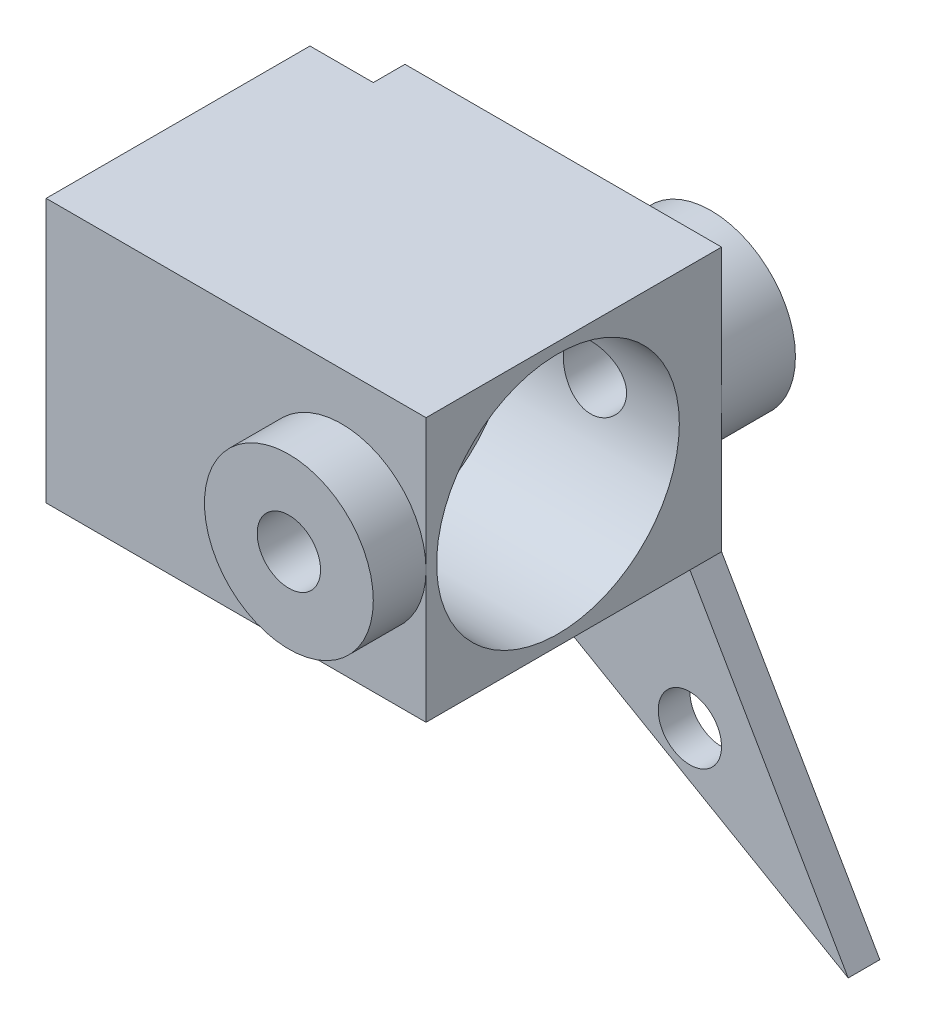
ISO-10303-21;
HEADER;
FILE_DESCRIPTION(('STEP AP214'),'2;1');
FILE_NAME('part.step','',(''),(''),'','','');
FILE_SCHEMA(('AUTOMOTIVE_DESIGN { 1 0 10303 214 1 1 1 1 }'));
ENDSEC;
DATA;
#1=APPLICATION_CONTEXT('core data for automotive mechanical design processes');
#2=APPLICATION_PROTOCOL_DEFINITION('international standard','automotive_design',2000,#1);
#3=PRODUCT_CONTEXT('',#1,'mechanical');
#4=PRODUCT('Part','Part','',(#3));
#5=PRODUCT_RELATED_PRODUCT_CATEGORY('part','',(#4));
#6=PRODUCT_DEFINITION_FORMATION('','',#4);
#7=PRODUCT_DEFINITION_CONTEXT('part definition',#1,'design');
#8=PRODUCT_DEFINITION('design','',#6,#7);
#9=PRODUCT_DEFINITION_SHAPE('','',#8);
#10=(LENGTH_UNIT() NAMED_UNIT(*) SI_UNIT(.MILLI.,.METRE.));
#11=(NAMED_UNIT(*) PLANE_ANGLE_UNIT() SI_UNIT($,.RADIAN.));
#12=(NAMED_UNIT(*) SI_UNIT($,.STERADIAN.) SOLID_ANGLE_UNIT());
#13=UNCERTAINTY_MEASURE_WITH_UNIT(LENGTH_MEASURE(1.E-05),#10,'distance_accuracy_value','');
#14=(GEOMETRIC_REPRESENTATION_CONTEXT(3) GLOBAL_UNCERTAINTY_ASSIGNED_CONTEXT((#13)) GLOBAL_UNIT_ASSIGNED_CONTEXT((#10,
#11,#12)) REPRESENTATION_CONTEXT('',''));
#15=CARTESIAN_POINT('',(0.,0.,0.));
#16=DIRECTION('',(0.,0.,1.));
#17=DIRECTION('',(1.,0.,0.));
#18=AXIS2_PLACEMENT_3D('',#15,#16,#17);
#19=CARTESIAN_POINT('',(0.,0.,0.));
#20=DIRECTION('',(0.,0.,1.));
#21=DIRECTION('',(1.,0.,0.));
#22=AXIS2_PLACEMENT_3D('',#19,#20,#21);
#23=PLANE('',#22);
#24=DIRECTION('',(0.,1.,0.));
#25=VECTOR('',#24,1.);
#26=CARTESIAN_POINT('',(-12.5,0.,0.));
#27=LINE('',#26,#25);
#28=CARTESIAN_POINT('',(-12.5,-12.5,0.));
#29=VERTEX_POINT('',#28);
#30=CARTESIAN_POINT('',(-12.5,12.5,0.));
#31=VERTEX_POINT('',#30);
#32=EDGE_CURVE('E73',#29,#31,#27,.T.);
#33=ORIENTED_EDGE('',*,*,#32,.F.);
#34=DIRECTION('',(1.,0.,0.));
#35=VECTOR('',#34,1.);
#36=CARTESIAN_POINT('',(0.,-12.5,0.));
#37=LINE('',#36,#35);
#38=CARTESIAN_POINT('',(-18.5,-12.5,0.));
#39=VERTEX_POINT('',#38);
#40=EDGE_CURVE('E223',#39,#29,#37,.T.);
#41=ORIENTED_EDGE('',*,*,#40,.F.);
#42=DIRECTION('',(0.,-1.,0.));
#43=VECTOR('',#42,1.);
#44=CARTESIAN_POINT('',(-18.5,-12.5,0.));
#45=LINE('',#44,#43);
#46=CARTESIAN_POINT('',(-18.5,12.5,0.));
#47=VERTEX_POINT('',#46);
#48=EDGE_CURVE('E137',#47,#39,#45,.T.);
#49=ORIENTED_EDGE('',*,*,#48,.F.);
#50=DIRECTION('',(1.,0.,0.));
#51=VECTOR('',#50,1.);
#52=CARTESIAN_POINT('',(0.,12.5,0.));
#53=LINE('',#52,#51);
#54=EDGE_CURVE('E68',#47,#31,#53,.T.);
#55=ORIENTED_EDGE('',*,*,#54,.T.);
#56=EDGE_LOOP('',(#33,#41,#49,#55));
#57=FACE_BOUND('',#56,.T.);
#58=ADVANCED_FACE('F46',(#57),#23,.F.);
#59=CARTESIAN_POINT('',(9.5,0.,-10.));
#60=DIRECTION('',(0.,0.,1.));
#61=DIRECTION('',(1.,0.,0.));
#62=AXIS2_PLACEMENT_3D('',#59,#60,#61);
#63=CYLINDRICAL_SURFACE('',#62,3.);
#64=CARTESIAN_POINT('',(12.5,0.,0.999999999994318));
#65=CARTESIAN_POINT('',(12.4999958061313,0.165513100860299,1.00000261578605));
#66=CARTESIAN_POINT('',(12.4862567268818,0.331071792667569,1.00360852641583));
#67=CARTESIAN_POINT('',(12.4317553681837,0.657428520127667,1.01764330962879));
#68=CARTESIAN_POINT('',(12.3909792667408,0.818224076801244,1.02807567202709));
#69=CARTESIAN_POINT('',(12.2838132581872,1.13029583329107,1.05461056392123));
#70=CARTESIAN_POINT('',(12.2174555774255,1.28158373259807,1.0707059572049));
#71=CARTESIAN_POINT('',(12.0611273860711,1.57088220036603,1.10686126041007));
#72=CARTESIAN_POINT('',(11.9711555735508,1.70889203618857,1.12692138890587));
#73=CARTESIAN_POINT('',(11.7680371060725,1.97079048735204,1.16933565333557));
#74=CARTESIAN_POINT('',(11.6544627072966,2.09434123783155,1.19172766332375));
#75=CARTESIAN_POINT('',(11.40827790935,2.32087548199199,1.23603582075992));
#76=CARTESIAN_POINT('',(11.2756651729633,2.42385644673366,1.25795190940119));
#77=CARTESIAN_POINT('',(10.9924973047783,2.60795448399087,1.29921221666407));
#78=CARTESIAN_POINT('',(10.8416843353429,2.68868668283712,1.31850854350326));
#79=CARTESIAN_POINT('',(10.528041481103,2.82351791781966,1.35178925345616));
#80=CARTESIAN_POINT('',(10.3652137124381,2.87762163115711,1.36577456933189));
#81=CARTESIAN_POINT('',(10.035895846133,2.9564940550528,1.3864593801617));
#82=CARTESIAN_POINT('',(9.86956177362503,2.98187355292015,1.3933103163138));
#83=CARTESIAN_POINT('',(9.53486657150606,3.00448073974606,1.39940344067351));
#84=CARTESIAN_POINT('',(9.36650580845183,3.00171344526939,1.3986469847366));
#85=CARTESIAN_POINT('',(9.03727290222882,2.96859135930547,1.38974654849018));
#86=CARTESIAN_POINT('',(8.87632064812183,2.9389716144502,1.38179941370127));
#87=CARTESIAN_POINT('',(8.56175290049769,2.85416102354825,1.35972772105193));
#88=CARTESIAN_POINT('',(8.40813797183271,2.79896821228888,1.34560268844344));
#89=CARTESIAN_POINT('',(8.1106699876766,2.66396957573277,1.31259096725328));
#90=CARTESIAN_POINT('',(7.96694112372614,2.58390285471208,1.29365421247633));
#91=CARTESIAN_POINT('',(7.69469880263451,2.40161136377509,1.25318013149444));
#92=CARTESIAN_POINT('',(7.56618823075147,2.29938240245393,1.23164231370859));
#93=CARTESIAN_POINT('',(7.32382626318911,2.07189255916669,1.18757014458383));
#94=CARTESIAN_POINT('',(7.2105563268274,1.946013332897,1.16502565182396));
#95=CARTESIAN_POINT('',(7.00661795355001,1.67677263038272,1.12208325375354));
#96=CARTESIAN_POINT('',(6.91595033321012,1.53341052279567,1.101685426013));
#97=CARTESIAN_POINT('',(6.75954950120155,1.23239828878866,1.06521794335912));
#98=CARTESIAN_POINT('',(6.69391768476389,1.0746931981324,1.0491659637199));
#99=CARTESIAN_POINT('',(6.59026320193476,0.749974407216019,1.0233267982061));
#100=CARTESIAN_POINT('',(6.55223477013406,0.582962658651929,1.01353830415281));
#101=CARTESIAN_POINT('',(6.50577064496216,0.249336896290359,1.00152534029361));
#102=CARTESIAN_POINT('',(6.49654396120739,0.0828401568193054,0.999098742576637));
#103=CARTESIAN_POINT('',(6.50576612469069,-0.24932047200086,1.00150378038978));
#104=CARTESIAN_POINT('',(6.52421224328683,-0.414984441848129,1.00633470030155));
#105=CARTESIAN_POINT('',(6.58760640920778,-0.73798019797212,1.0225817643585));
#106=CARTESIAN_POINT('',(6.63211669484639,-0.895403878510947,1.03388906707069));
#107=CARTESIAN_POINT('',(6.74587031770228,-1.20053743045728,1.06180937102979));
#108=CARTESIAN_POINT('',(6.81511627409266,-1.34824627123263,1.0784229341182));
#109=CARTESIAN_POINT('',(6.97786600918619,-1.63285688723239,1.11559030801735));
#110=CARTESIAN_POINT('',(7.07180461133014,-1.7695008228384,1.13621282117842));
#111=CARTESIAN_POINT('',(7.28072321530767,-2.02536444506459,1.17901260171907));
#112=CARTESIAN_POINT('',(7.39570718759906,-2.14458083612579,1.20119016198879));
#113=CARTESIAN_POINT('',(7.64713765571247,-2.36551255989495,1.24533853475134));
#114=CARTESIAN_POINT('',(7.78407826398584,-2.46667088847343,1.26728774019604));
#115=CARTESIAN_POINT('',(8.07345121979507,-2.64457935536873,1.30783498127531));
#116=CARTESIAN_POINT('',(8.22588290134636,-2.72133054240005,1.32643316088029));
#117=CARTESIAN_POINT('',(8.54112583841064,-2.84766857265181,1.3579613427396));
#118=CARTESIAN_POINT('',(8.70386977709193,-2.89741467502046,1.37092448453461));
#119=CARTESIAN_POINT('',(9.03580585053428,-2.96872395986275,1.38973160643499));
#120=CARTESIAN_POINT('',(9.20499641292087,-2.99029396995785,1.39557731121204));
#121=CARTESIAN_POINT('',(9.53933294148051,-3.00425859429513,1.3993480420967));
#122=CARTESIAN_POINT('',(9.70443942703428,-2.99754663404827,1.39751562976714));
#123=CARTESIAN_POINT('',(10.031078743958,-2.95720046555001,1.38670198516372));
#124=CARTESIAN_POINT('',(10.1926116598178,-2.92356689450649,1.37772092209137));
#125=CARTESIAN_POINT('',(10.5064483664403,-2.83083978633454,1.35376309157632));
#126=CARTESIAN_POINT('',(10.658809313993,-2.77192786169538,1.33882914600445));
#127=CARTESIAN_POINT('',(10.9515978984777,-2.63045811008315,1.30464550165221));
#128=CARTESIAN_POINT('',(11.0920237342674,-2.54789672232776,1.28539515306733));
#129=CARTESIAN_POINT('',(11.3612392966653,-2.35873097869853,1.24406835110426));
#130=CARTESIAN_POINT('',(11.4895882249428,-2.25151328856471,1.22192742238949));
#131=CARTESIAN_POINT('',(11.726762822395,-2.01725513432171,1.17768284336483));
#132=CARTESIAN_POINT('',(11.8355837799059,-1.89020990005608,1.1555792033228));
#133=CARTESIAN_POINT('',(12.0327687767881,-1.61680516286449,1.11336600337295));
#134=CARTESIAN_POINT('',(12.1206750591729,-1.47010728053361,1.0933057574504));
#135=CARTESIAN_POINT('',(12.2704391212127,-1.16350012002815,1.05797191112365));
#136=CARTESIAN_POINT('',(12.3323143145445,-1.00359975967301,1.0426951125543));
#137=CARTESIAN_POINT('',(12.4197915871607,-0.703483555588702,1.02072600691194));
#138=CARTESIAN_POINT('',(12.449801628113,-0.564611293459929,1.01300922678294));
#139=CARTESIAN_POINT('',(12.4899067376189,-0.283837014202407,1.00264532961162));
#140=CARTESIAN_POINT('',(12.5000035964397,-0.141935270594578,0.999997756829844));
#141=CARTESIAN_POINT('',(12.5,0.,0.999999999994318));
#142=B_SPLINE_CURVE_WITH_KNOTS('',3,(#64,#65,#66,#67,#68,#69,#70,#71,#72,#73,#74,#75,#76,#77,
#78,#79,#80,#81,#82,#83,#84,#85,#86,#87,#88,#89,#90,#91,#92,#93,#94,#95,#96,#97,#98,#99,#100,
#101,#102,#103,#104,#105,#106,#107,#108,#109,#110,#111,#112,#113,#114,#115,#116,#117,#118,#119,
#120,#121,#122,#123,#124,#125,#126,#127,#128,#129,#130,#131,#132,#133,#134,#135,#136,#137,#138,
#139,#140,#141),.UNSPECIFIED.,.T.,.F.,(4,2,2,2,2,2,2,2,2,2,2,2,2,2,2,2,2,2,2,2,2,2,2,2,2,2,2,2,
2,2,2,2,2,2,2,2,2,2,4),(0.,0.496018922637786,0.992291618127655,1.48794116718857,
1.98361804884229,2.48921443639205,2.99487294596056,3.50879636483811,4.02262948260506,
4.52531823554629,5.02791739652045,5.5171608084105,6.00644182341183,6.50103868312977,
6.99572916456499,7.50583207603594,8.01595341381998,8.52811935034126,9.04017828199353,
9.53804479083304,10.0358622113971,10.5255490579065,11.0152877710096,11.5143071256334,
12.0134207233813,12.52595963138,13.0384765138731,13.5479371169049,14.0572742446952,
14.5506440866168,15.0440022513079,15.533873717558,16.0238189801283,16.5276054380276,
17.0315132854091,17.5456025841075,18.0593474302639,18.4847452383112,18.9101047998123),.UNSPECIFIED.);
#143=CARTESIAN_POINT('',(12.5,0.,0.999999999994318));
#144=VERTEX_POINT('',#143);
#145=EDGE_CURVE('E50',#144,#144,#142,.T.);
#146=ORIENTED_EDGE('',*,*,#145,.T.);
#147=EDGE_LOOP('',(#146));
#148=FACE_BOUND('',#147,.T.);
#149=CARTESIAN_POINT('',(9.5,0.,-10.));
#150=DIRECTION('',(0.,0.,1.));
#151=DIRECTION('',(1.,0.,0.));
#152=AXIS2_PLACEMENT_3D('',#149,#150,#151);
#153=CIRCLE('',#152,3.);
#154=CARTESIAN_POINT('',(12.5,0.,-10.));
#155=VERTEX_POINT('',#154);
#156=EDGE_CURVE('E204',#155,#155,#153,.T.);
#157=ORIENTED_EDGE('',*,*,#156,.F.);
#158=EDGE_LOOP('',(#157));
#159=FACE_BOUND('',#158,.T.);
#160=ADVANCED_FACE('F280',(#148,#159),#63,.F.);
#161=CARTESIAN_POINT('',(17.5,0.,25.));
#162=DIRECTION('',(1.,0.,0.));
#163=DIRECTION('',(0.,0.,-1.));
#164=AXIS2_PLACEMENT_3D('',#161,#162,#163);
#165=PLANE('',#164);
#166=CARTESIAN_POINT('',(17.5,0.,12.4999999999943));
#167=DIRECTION('',(1.,0.,0.));
#168=DIRECTION('',(0.,0.,-1.));
#169=AXIS2_PLACEMENT_3D('',#166,#167,#168);
#170=CIRCLE('',#169,11.5);
#171=CARTESIAN_POINT('',(17.5,0.,0.999999999994316));
#172=VERTEX_POINT('',#171);
#173=EDGE_CURVE('E197',#172,#172,#170,.T.);
#174=ORIENTED_EDGE('',*,*,#173,.F.);
#175=EDGE_LOOP('',(#174));
#176=FACE_BOUND('',#175,.T.);
#177=DIRECTION('',(0.,0.,-1.));
#178=VECTOR('',#177,1.);
#179=CARTESIAN_POINT('',(17.5,-12.5,25.));
#180=LINE('',#179,#178);
#181=CARTESIAN_POINT('',(17.5,-12.5,25.));
#182=VERTEX_POINT('',#181);
#183=CARTESIAN_POINT('',(17.5,-12.5,0.));
#184=VERTEX_POINT('',#183);
#185=EDGE_CURVE('E60',#182,#184,#180,.T.);
#186=ORIENTED_EDGE('',*,*,#185,.T.);
#187=DIRECTION('',(0.,0.,1.));
#188=VECTOR('',#187,1.);
#189=CARTESIAN_POINT('',(17.5,-12.5,-3.));
#190=LINE('',#189,#188);
#191=CARTESIAN_POINT('',(17.5,-12.5,-3.));
#192=VERTEX_POINT('',#191);
#193=EDGE_CURVE('E191',#192,#184,#190,.T.);
#194=ORIENTED_EDGE('',*,*,#193,.F.);
#195=DIRECTION('',(0.,-1.,0.));
#196=VECTOR('',#195,1.);
#197=CARTESIAN_POINT('',(17.5,12.5,-3.));
#198=LINE('',#197,#196);
#199=CARTESIAN_POINT('',(17.5,0.,-3.));
#200=VERTEX_POINT('',#199);
#201=EDGE_CURVE('E153',#200,#192,#198,.T.);
#202=ORIENTED_EDGE('',*,*,#201,.F.);
#203=CARTESIAN_POINT('',(17.5,12.5,-3.));
#204=VERTEX_POINT('',#203);
#205=EDGE_CURVE('E154',#204,#200,#198,.T.);
#206=ORIENTED_EDGE('',*,*,#205,.F.);
#207=DIRECTION('',(0.,0.,-1.));
#208=VECTOR('',#207,1.);
#209=CARTESIAN_POINT('',(17.5,12.5,25.));
#210=LINE('',#209,#208);
#211=CARTESIAN_POINT('',(17.5,12.5,25.));
#212=VERTEX_POINT('',#211);
#213=EDGE_CURVE('E12',#212,#204,#210,.T.);
#214=ORIENTED_EDGE('',*,*,#213,.F.);
#215=DIRECTION('',(0.,-1.,0.));
#216=VECTOR('',#215,1.);
#217=CARTESIAN_POINT('',(17.5,0.,25.));
#218=LINE('',#217,#216);
#219=CARTESIAN_POINT('',(17.5,0.,25.));
#220=VERTEX_POINT('',#219);
#221=EDGE_CURVE('E128',#212,#220,#218,.T.);
#222=ORIENTED_EDGE('',*,*,#221,.T.);
#223=EDGE_CURVE('E219',#220,#182,#218,.T.);
#224=ORIENTED_EDGE('',*,*,#223,.T.);
#225=EDGE_LOOP('',(#186,#194,#202,#206,#214,#222,#224));
#226=FACE_BOUND('',#225,.T.);
#227=ADVANCED_FACE('F48',(#176,#226),#165,.T.);
#228=CARTESIAN_POINT('',(0.,12.5,25.));
#229=DIRECTION('',(0.,1.,0.));
#230=DIRECTION('',(0.,0.,1.));
#231=AXIS2_PLACEMENT_3D('',#228,#229,#230);
#232=PLANE('',#231);
#233=ORIENTED_EDGE('',*,*,#213,.T.);
#234=DIRECTION('',(1.,0.,0.));
#235=VECTOR('',#234,1.);
#236=CARTESIAN_POINT('',(0.,12.5,-3.));
#237=LINE('',#236,#235);
#238=CARTESIAN_POINT('',(-12.5,12.5,-3.));
#239=VERTEX_POINT('',#238);
#240=EDGE_CURVE('E172',#239,#204,#237,.T.);
#241=ORIENTED_EDGE('',*,*,#240,.F.);
#242=DIRECTION('',(0.,0.,1.));
#243=VECTOR('',#242,1.);
#244=CARTESIAN_POINT('',(-12.5,12.5,-3.));
#245=LINE('',#244,#243);
#246=EDGE_CURVE('E175',#239,#31,#245,.T.);
#247=ORIENTED_EDGE('',*,*,#246,.T.);
#248=ORIENTED_EDGE('',*,*,#54,.F.);
#249=DIRECTION('',(0.,0.,-1.));
#250=VECTOR('',#249,1.);
#251=CARTESIAN_POINT('',(-18.5,12.5,25.));
#252=LINE('',#251,#250);
#253=CARTESIAN_POINT('',(-18.5,12.5,25.));
#254=VERTEX_POINT('',#253);
#255=EDGE_CURVE('E133',#254,#47,#252,.T.);
#256=ORIENTED_EDGE('',*,*,#255,.F.);
#257=DIRECTION('',(1.,0.,0.));
#258=VECTOR('',#257,1.);
#259=CARTESIAN_POINT('',(0.,12.5,25.));
#260=LINE('',#259,#258);
#261=EDGE_CURVE('E120',#254,#212,#260,.T.);
#262=ORIENTED_EDGE('',*,*,#261,.T.);
#263=EDGE_LOOP('',(#233,#241,#247,#248,#256,#262));
#264=FACE_BOUND('',#263,.T.);
#265=ADVANCED_FACE('F134',(#264),#232,.T.);
#266=CARTESIAN_POINT('',(0.,-12.5,25.));
#267=DIRECTION('',(0.,1.,0.));
#268=DIRECTION('',(0.,0.,1.));
#269=AXIS2_PLACEMENT_3D('',#266,#267,#268);
#270=PLANE('',#269);
#271=ORIENTED_EDGE('',*,*,#40,.T.);
#272=DIRECTION('',(-1.,0.,0.));
#273=VECTOR('',#272,1.);
#274=CARTESIAN_POINT('',(0.,-12.5,0.));
#275=LINE('',#274,#273);
#276=EDGE_CURVE('E194',#184,#29,#275,.T.);
#277=ORIENTED_EDGE('',*,*,#276,.F.);
#278=ORIENTED_EDGE('',*,*,#185,.F.);
#279=DIRECTION('',(1.,0.,0.));
#280=VECTOR('',#279,1.);
#281=CARTESIAN_POINT('',(0.,-12.5,25.));
#282=LINE('',#281,#280);
#283=CARTESIAN_POINT('',(-18.5,-12.5,25.));
#284=VERTEX_POINT('',#283);
#285=EDGE_CURVE('E130',#284,#182,#282,.T.);
#286=ORIENTED_EDGE('',*,*,#285,.F.);
#287=DIRECTION('',(0.,0.,1.));
#288=VECTOR('',#287,1.);
#289=CARTESIAN_POINT('',(-18.5,-12.5,25.));
#290=LINE('',#289,#288);
#291=EDGE_CURVE('E143',#39,#284,#290,.T.);
#292=ORIENTED_EDGE('',*,*,#291,.F.);
#293=EDGE_LOOP('',(#271,#277,#278,#286,#292));
#294=FACE_BOUND('',#293,.T.);
#295=ADVANCED_FACE('F289',(#294),#270,.F.);
#296=CARTESIAN_POINT('',(0.,0.,25.));
#297=DIRECTION('',(0.,0.,1.));
#298=DIRECTION('',(1.,0.,0.));
#299=AXIS2_PLACEMENT_3D('',#296,#297,#298);
#300=PLANE('',#299);
#301=ORIENTED_EDGE('',*,*,#223,.F.);
#302=CARTESIAN_POINT('',(9.5,0.,25.));
#303=DIRECTION('',(0.,0.,1.));
#304=DIRECTION('',(1.,0.,0.));
#305=AXIS2_PLACEMENT_3D('',#302,#303,#304);
#306=CIRCLE('',#305,8.);
#307=EDGE_CURVE('E213',#220,#220,#306,.T.);
#308=ORIENTED_EDGE('',*,*,#307,.F.);
#309=ORIENTED_EDGE('',*,*,#221,.F.);
#310=ORIENTED_EDGE('',*,*,#261,.F.);
#311=DIRECTION('',(0.,1.,0.));
#312=VECTOR('',#311,1.);
#313=CARTESIAN_POINT('',(-18.5,-12.5,25.));
#314=LINE('',#313,#312);
#315=EDGE_CURVE('E126',#284,#254,#314,.T.);
#316=ORIENTED_EDGE('',*,*,#315,.F.);
#317=ORIENTED_EDGE('',*,*,#285,.T.);
#318=EDGE_LOOP('',(#301,#308,#309,#310,#316,#317));
#319=FACE_BOUND('',#318,.T.);
#320=ADVANCED_FACE('F123',(#319),#300,.T.);
#321=CARTESIAN_POINT('',(9.5,0.,30.));
#322=DIRECTION('',(0.,0.,-1.));
#323=DIRECTION('',(-1.,0.,0.));
#324=AXIS2_PLACEMENT_3D('',#321,#322,#323);
#325=CYLINDRICAL_SURFACE('',#324,8.);
#326=CARTESIAN_POINT('',(9.5,0.,30.));
#327=DIRECTION('',(0.,0.,1.));
#328=DIRECTION('',(1.,0.,0.));
#329=AXIS2_PLACEMENT_3D('',#326,#327,#328);
#330=CIRCLE('',#329,8.);
#331=CARTESIAN_POINT('',(17.5,0.,30.));
#332=VERTEX_POINT('',#331);
#333=EDGE_CURVE('E214',#332,#332,#330,.T.);
#334=ORIENTED_EDGE('',*,*,#333,.F.);
#335=EDGE_LOOP('',(#334));
#336=FACE_BOUND('',#335,.T.);
#337=ORIENTED_EDGE('',*,*,#307,.T.);
#338=EDGE_LOOP('',(#337));
#339=FACE_BOUND('',#338,.T.);
#340=ADVANCED_FACE('F315',(#336,#339),#325,.T.);
#341=CARTESIAN_POINT('',(9.5,0.,30.));
#342=DIRECTION('',(0.,0.,1.));
#343=DIRECTION('',(1.,0.,0.));
#344=AXIS2_PLACEMENT_3D('',#341,#342,#343);
#345=PLANE('',#344);
#346=CARTESIAN_POINT('',(9.5,0.,30.));
#347=DIRECTION('',(0.,0.,1.));
#348=DIRECTION('',(1.,0.,0.));
#349=AXIS2_PLACEMENT_3D('',#346,#347,#348);
#350=CIRCLE('',#349,3.);
#351=CARTESIAN_POINT('',(12.5,0.,30.));
#352=VERTEX_POINT('',#351);
#353=EDGE_CURVE('E208',#352,#352,#350,.T.);
#354=ORIENTED_EDGE('',*,*,#353,.F.);
#355=EDGE_LOOP('',(#354));
#356=FACE_BOUND('',#355,.T.);
#357=ORIENTED_EDGE('',*,*,#333,.T.);
#358=EDGE_LOOP('',(#357));
#359=FACE_BOUND('',#358,.T.);
#360=ADVANCED_FACE('F317',(#356,#359),#345,.T.);
#361=CARTESIAN_POINT('',(9.5,0.,-10.));
#362=DIRECTION('',(0.,0.,1.));
#363=DIRECTION('',(1.,0.,0.));
#364=AXIS2_PLACEMENT_3D('',#361,#362,#363);
#365=CYLINDRICAL_SURFACE('',#364,8.);
#366=CARTESIAN_POINT('',(9.5,0.,-3.));
#367=DIRECTION('',(0.,0.,-1.));
#368=DIRECTION('',(-1.,0.,0.));
#369=AXIS2_PLACEMENT_3D('',#366,#367,#368);
#370=CIRCLE('',#369,8.);
#371=EDGE_CURVE('E161',#200,#200,#370,.F.);
#372=ORIENTED_EDGE('',*,*,#371,.F.);
#373=EDGE_LOOP('',(#372));
#374=FACE_BOUND('',#373,.T.);
#375=CARTESIAN_POINT('',(9.5,0.,-10.));
#376=DIRECTION('',(0.,0.,-1.));
#377=DIRECTION('',(-1.,0.,0.));
#378=AXIS2_PLACEMENT_3D('',#375,#376,#377);
#379=CIRCLE('',#378,8.);
#380=CARTESIAN_POINT('',(1.5,0.,-10.));
#381=VERTEX_POINT('',#380);
#382=EDGE_CURVE('E207',#381,#381,#379,.T.);
#383=ORIENTED_EDGE('',*,*,#382,.F.);
#384=EDGE_LOOP('',(#383));
#385=FACE_BOUND('',#384,.T.);
#386=ADVANCED_FACE('F323',(#374,#385),#365,.T.);
#387=CARTESIAN_POINT('',(9.5,0.,-10.));
#388=DIRECTION('',(0.,0.,-1.));
#389=DIRECTION('',(-1.,0.,0.));
#390=AXIS2_PLACEMENT_3D('',#387,#388,#389);
#391=PLANE('',#390);
#392=ORIENTED_EDGE('',*,*,#156,.T.);
#393=EDGE_LOOP('',(#392));
#394=FACE_BOUND('',#393,.T.);
#395=ORIENTED_EDGE('',*,*,#382,.T.);
#396=EDGE_LOOP('',(#395));
#397=FACE_BOUND('',#396,.T.);
#398=ADVANCED_FACE('F329',(#394,#397),#391,.T.);
#399=CARTESIAN_POINT('',(12.5,0.,23.9999999999943));
#400=CARTESIAN_POINT('',(12.4999958061313,-0.165513100860299,23.9999973842026));
#401=CARTESIAN_POINT('',(12.4862567268818,-0.331071792667569,23.9963914735728));
#402=CARTESIAN_POINT('',(12.4317553681837,-0.657428520127667,23.9823566903598));
#403=CARTESIAN_POINT('',(12.3909792667408,-0.818224076801244,23.9719243279615));
#404=CARTESIAN_POINT('',(12.2838132581872,-1.13029583329107,23.9453894360674));
#405=CARTESIAN_POINT('',(12.2174555774255,-1.28158373259807,23.9292940427837));
#406=CARTESIAN_POINT('',(12.0611273860711,-1.57088220036603,23.8931387395786));
#407=CARTESIAN_POINT('',(11.9711555735508,-1.70889203618857,23.8730786110828));
#408=CARTESIAN_POINT('',(11.7680371060725,-1.97079048735204,23.8306643466531));
#409=CARTESIAN_POINT('',(11.6544627072966,-2.09434123783155,23.8082723366649));
#410=CARTESIAN_POINT('',(11.40827790935,-2.32087548199199,23.7639641792287));
#411=CARTESIAN_POINT('',(11.2756651729633,-2.42385644673366,23.7420480905874));
#412=CARTESIAN_POINT('',(10.9924973047783,-2.60795448399087,23.7007877833246));
#413=CARTESIAN_POINT('',(10.8416843353429,-2.68868668283712,23.6814914564854));
#414=CARTESIAN_POINT('',(10.528041481103,-2.82351791781966,23.6482107465325));
#415=CARTESIAN_POINT('',(10.3652137124381,-2.87762163115711,23.6342254306567));
#416=CARTESIAN_POINT('',(10.035895846133,-2.9564940550528,23.6135406198269));
#417=CARTESIAN_POINT('',(9.86956177362503,-2.98187355292015,23.6066896836748));
#418=CARTESIAN_POINT('',(9.53486657150606,-3.00448073974606,23.6005965593151));
#419=CARTESIAN_POINT('',(9.36650580845183,-3.00171344526939,23.601353015252));
#420=CARTESIAN_POINT('',(9.03727290222881,-2.96859135930547,23.6102534514985));
#421=CARTESIAN_POINT('',(8.87632064812182,-2.9389716144502,23.6182005862874));
#422=CARTESIAN_POINT('',(8.56175290049768,-2.85416102354825,23.6402722789367));
#423=CARTESIAN_POINT('',(8.40813797183271,-2.79896821228888,23.6543973115452));
#424=CARTESIAN_POINT('',(8.1106699876766,-2.66396957573277,23.6874090327354));
#425=CARTESIAN_POINT('',(7.96694112372614,-2.58390285471208,23.7063457875123));
#426=CARTESIAN_POINT('',(7.69469880263451,-2.40161136377509,23.7468198684942));
#427=CARTESIAN_POINT('',(7.56618823075147,-2.29938240245393,23.76835768628));
#428=CARTESIAN_POINT('',(7.32382626318911,-2.07189255916669,23.8124298554048));
#429=CARTESIAN_POINT('',(7.2105563268274,-1.946013332897,23.8349743481647));
#430=CARTESIAN_POINT('',(7.00661795355001,-1.67677263038272,23.8779167462351));
#431=CARTESIAN_POINT('',(6.91595033321012,-1.53341052279567,23.8983145739756));
#432=CARTESIAN_POINT('',(6.75954950120155,-1.23239828878866,23.9347820566295));
#433=CARTESIAN_POINT('',(6.69391768476389,-1.0746931981324,23.9508340362687));
#434=CARTESIAN_POINT('',(6.59026320193476,-0.749974407216019,23.9766732017825));
#435=CARTESIAN_POINT('',(6.55223477013406,-0.582962658651929,23.9864616958358));
#436=CARTESIAN_POINT('',(6.50577064496216,-0.249336896290359,23.998474659695));
#437=CARTESIAN_POINT('',(6.49654396120739,-0.0828401568193055,24.000901257412));
#438=CARTESIAN_POINT('',(6.50576612469069,0.24932047200086,23.9984962195989));
#439=CARTESIAN_POINT('',(6.52421224328683,0.41498444184813,23.9936652996871));
#440=CARTESIAN_POINT('',(6.58760640920778,0.73798019797212,23.9774182356301));
#441=CARTESIAN_POINT('',(6.63211669484639,0.895403878510947,23.9661109329179));
#442=CARTESIAN_POINT('',(6.74587031770228,1.20053743045728,23.9381906289588));
#443=CARTESIAN_POINT('',(6.81511627409266,1.34824627123263,23.9215770658704));
#444=CARTESIAN_POINT('',(6.97786600918619,1.63285688723239,23.8844096919713));
#445=CARTESIAN_POINT('',(7.07180461133014,1.7695008228384,23.8637871788102));
#446=CARTESIAN_POINT('',(7.28072321530767,2.02536444506459,23.8209873982696));
#447=CARTESIAN_POINT('',(7.39570718759906,2.14458083612578,23.7988098379998));
#448=CARTESIAN_POINT('',(7.64713765571247,2.36551255989495,23.7546614652373));
#449=CARTESIAN_POINT('',(7.78407826398584,2.46667088847343,23.7327122597926));
#450=CARTESIAN_POINT('',(8.07345121979507,2.64457935536873,23.6921650187133));
#451=CARTESIAN_POINT('',(8.22588290134636,2.72133054240005,23.6735668391083));
#452=CARTESIAN_POINT('',(8.54112583841064,2.84766857265181,23.642038657249));
#453=CARTESIAN_POINT('',(8.70386977709193,2.89741467502046,23.629075515454));
#454=CARTESIAN_POINT('',(9.03580585053428,2.96872395986275,23.6102683935536));
#455=CARTESIAN_POINT('',(9.20499641292087,2.99029396995785,23.6044226887766));
#456=CARTESIAN_POINT('',(9.53933294148051,3.00425859429513,23.6006519578919));
#457=CARTESIAN_POINT('',(9.70443942703428,2.99754663404827,23.6024843702215));
#458=CARTESIAN_POINT('',(10.031078743958,2.95720046555001,23.6132980148249));
#459=CARTESIAN_POINT('',(10.1926116598178,2.92356689450649,23.6222790778973));
#460=CARTESIAN_POINT('',(10.5064483664403,2.83083978633454,23.6462369084123));
#461=CARTESIAN_POINT('',(10.658809313993,2.77192786169538,23.6611708539842));
#462=CARTESIAN_POINT('',(10.9515978984777,2.63045811008315,23.6953544983364));
#463=CARTESIAN_POINT('',(11.0920237342674,2.54789672232776,23.7146048469213));
#464=CARTESIAN_POINT('',(11.3612392966653,2.35873097869853,23.7559316488844));
#465=CARTESIAN_POINT('',(11.4895882249428,2.25151328856471,23.7780725775991));
#466=CARTESIAN_POINT('',(11.726762822395,2.01725513432172,23.8223171566238));
#467=CARTESIAN_POINT('',(11.8355837799059,1.89020990005608,23.8444207966658));
#468=CARTESIAN_POINT('',(12.0327687767881,1.61680516286449,23.8866339966157));
#469=CARTESIAN_POINT('',(12.1206750591729,1.47010728053361,23.9066942425382));
#470=CARTESIAN_POINT('',(12.2704391212127,1.16350012002815,23.942028088865));
#471=CARTESIAN_POINT('',(12.3323143145445,1.00359975967301,23.9573048874343));
#472=CARTESIAN_POINT('',(12.4197915871607,0.703483555588702,23.9792739930767));
#473=CARTESIAN_POINT('',(12.449801628113,0.564611293459929,23.9869907732057));
#474=CARTESIAN_POINT('',(12.4899067376189,0.283837014202407,23.997354670377));
#475=CARTESIAN_POINT('',(12.5000035964397,0.141935270594578,24.0000022431588));
#476=CARTESIAN_POINT('',(12.5,0.,23.9999999999943));
#477=B_SPLINE_CURVE_WITH_KNOTS('',3,(#399,#400,#401,#402,#403,#404,#405,#406,#407,#408,#409,
#410,#411,#412,#413,#414,#415,#416,#417,#418,#419,#420,#421,#422,#423,#424,#425,#426,#427,#428,
#429,#430,#431,#432,#433,#434,#435,#436,#437,#438,#439,#440,#441,#442,#443,#444,#445,#446,#447,
#448,#449,#450,#451,#452,#453,#454,#455,#456,#457,#458,#459,#460,#461,#462,#463,#464,#465,#466,
#467,#468,#469,#470,#471,#472,#473,#474,#475,#476),.UNSPECIFIED.,.T.,.F.,(4,2,2,2,2,2,2,2,2,2,2,
2,2,2,2,2,2,2,2,2,2,2,2,2,2,2,2,2,2,2,2,2,2,2,2,2,2,2,4),(0.,0.496018922637785,
0.992291618127655,1.48794116718857,1.98361804884229,2.48921443639205,2.99487294596056,
3.50879636483811,4.02262948260506,4.5253182355463,5.02791739652046,5.5171608084105,
6.00644182341183,6.50103868312977,6.99572916456499,7.50583207603594,8.01595341381998,
8.52811935034126,9.04017828199353,9.53804479083304,10.0358622113971,10.5255490579065,
11.0152877710096,11.5143071256334,12.0134207233813,12.52595963138,13.0384765138731,
13.5479371169049,14.0572742446951,14.5506440866168,15.0440022513079,15.533873717558,
16.0238189801283,16.5276054380276,17.0315132854091,17.5456025841075,18.0593474302639,
18.4847452383112,18.9101047998123),.UNSPECIFIED.);
#478=CARTESIAN_POINT('',(12.5,0.,23.9999999999943));
#479=VERTEX_POINT('',#478);
#480=EDGE_CURVE('E201',#479,#479,#477,.T.);
#481=ORIENTED_EDGE('',*,*,#480,.T.);
#482=EDGE_LOOP('',(#481));
#483=FACE_BOUND('',#482,.T.);
#484=ORIENTED_EDGE('',*,*,#353,.T.);
#485=EDGE_LOOP('',(#484));
#486=FACE_BOUND('',#485,.T.);
#487=ADVANCED_FACE('F230',(#483,#486),#63,.F.);
#488=CARTESIAN_POINT('',(1.5,0.,12.4999999999943));
#489=DIRECTION('',(1.,0.,0.));
#490=DIRECTION('',(0.,0.,-1.));
#491=AXIS2_PLACEMENT_3D('',#488,#489,#490);
#492=CYLINDRICAL_SURFACE('',#491,11.5);
#493=ORIENTED_EDGE('',*,*,#480,.F.);
#494=EDGE_LOOP('',(#493));
#495=FACE_BOUND('',#494,.T.);
#496=CARTESIAN_POINT('',(1.5,0.,12.4999999999943));
#497=DIRECTION('',(1.,0.,0.));
#498=DIRECTION('',(0.,0.,-1.));
#499=AXIS2_PLACEMENT_3D('',#496,#497,#498);
#500=CIRCLE('',#499,11.5);
#501=CARTESIAN_POINT('',(1.5,0.,0.999999999994316));
#502=VERTEX_POINT('',#501);
#503=EDGE_CURVE('E198',#502,#502,#500,.T.);
#504=ORIENTED_EDGE('',*,*,#503,.F.);
#505=EDGE_LOOP('',(#504));
#506=FACE_BOUND('',#505,.T.);
#507=ORIENTED_EDGE('',*,*,#173,.T.);
#508=EDGE_LOOP('',(#507));
#509=FACE_BOUND('',#508,.T.);
#510=ORIENTED_EDGE('',*,*,#145,.F.);
#511=EDGE_LOOP('',(#510));
#512=FACE_BOUND('',#511,.T.);
#513=ADVANCED_FACE('F233',(#495,#506,#509,#512),#492,.F.);
#514=CARTESIAN_POINT('',(1.5,0.,12.4999999999943));
#515=DIRECTION('',(1.,0.,0.));
#516=DIRECTION('',(0.,0.,-1.));
#517=AXIS2_PLACEMENT_3D('',#514,#515,#516);
#518=PLANE('',#517);
#519=ORIENTED_EDGE('',*,*,#503,.T.);
#520=EDGE_LOOP('',(#519));
#521=FACE_BOUND('',#520,.T.);
#522=ADVANCED_FACE('F237',(#521),#518,.T.);
#523=CARTESIAN_POINT('',(0.,0.,0.));
#524=DIRECTION('',(0.,0.,-1.));
#525=DIRECTION('',(-1.,0.,0.));
#526=AXIS2_PLACEMENT_3D('',#523,#524,#525);
#527=PLANE('',#526);
#528=CARTESIAN_POINT('',(17.5,-25.4903810567665,0.));
#529=DIRECTION('',(0.,0.,-1.));
#530=DIRECTION('',(-1.,0.,0.));
#531=AXIS2_PLACEMENT_3D('',#528,#529,#530);
#532=CIRCLE('',#531,3.);
#533=CARTESIAN_POINT('',(14.5,-25.4903810567665,0.));
#534=VERTEX_POINT('',#533);
#535=EDGE_CURVE('E157',#534,#534,#532,.T.);
#536=ORIENTED_EDGE('',*,*,#535,.T.);
#537=EDGE_LOOP('',(#536));
#538=FACE_BOUND('',#537,.T.);
#539=DIRECTION('',(0.500000000000004,-0.866025403784436,0.));
#540=VECTOR('',#539,1.);
#541=CARTESIAN_POINT('',(7.71234122634716,4.45272228311383,0.));
#542=LINE('',#541,#540);
#543=CARTESIAN_POINT('',(32.5000000000001,-38.4807621135331,0.));
#544=VERTEX_POINT('',#543);
#545=EDGE_CURVE('E178',#184,#544,#542,.T.);
#546=ORIENTED_EDGE('',*,*,#545,.F.);
#547=ORIENTED_EDGE('',*,*,#276,.T.);
#548=DIRECTION('',(0.86602540378444,-0.499999999999998,0.));
#549=VECTOR('',#548,1.);
#550=CARTESIAN_POINT('',(-8.5376587736527,-14.7876587736528,0.));
#551=LINE('',#550,#549);
#552=EDGE_CURVE('E181',#29,#544,#551,.T.);
#553=ORIENTED_EDGE('',*,*,#552,.T.);
#554=EDGE_LOOP('',(#546,#547,#553));
#555=FACE_BOUND('',#554,.T.);
#556=ADVANCED_FACE('F242',(#538,#555),#527,.F.);
#557=CARTESIAN_POINT('',(7.71234122634716,4.45272228311383,-3.));
#558=DIRECTION('',(-0.866025403784436,-0.500000000000004,0.));
#559=DIRECTION('',(0.500000000000004,-0.866025403784436,0.));
#560=AXIS2_PLACEMENT_3D('',#557,#558,#559);
#561=PLANE('',#560);
#562=ORIENTED_EDGE('',*,*,#545,.T.);
#563=DIRECTION('',(0.,0.,1.));
#564=VECTOR('',#563,1.);
#565=CARTESIAN_POINT('',(32.5000000000001,-38.4807621135331,-3.));
#566=LINE('',#565,#564);
#567=CARTESIAN_POINT('',(32.5000000000001,-38.4807621135331,-3.));
#568=VERTEX_POINT('',#567);
#569=EDGE_CURVE('E189',#568,#544,#566,.T.);
#570=ORIENTED_EDGE('',*,*,#569,.F.);
#571=DIRECTION('',(0.500000000000004,-0.866025403784436,0.));
#572=VECTOR('',#571,1.);
#573=CARTESIAN_POINT('',(7.71234122634716,4.45272228311383,-3.));
#574=LINE('',#573,#572);
#575=EDGE_CURVE('E164',#192,#568,#574,.T.);
#576=ORIENTED_EDGE('',*,*,#575,.F.);
#577=ORIENTED_EDGE('',*,*,#193,.T.);
#578=EDGE_LOOP('',(#562,#570,#576,#577));
#579=FACE_BOUND('',#578,.T.);
#580=ADVANCED_FACE('F250',(#579),#561,.F.);
#581=CARTESIAN_POINT('',(-8.5376587736527,-14.7876587736528,-3.));
#582=DIRECTION('',(-0.499999999999998,-0.86602540378444,0.));
#583=DIRECTION('',(0.86602540378444,-0.499999999999998,0.));
#584=AXIS2_PLACEMENT_3D('',#581,#582,#583);
#585=PLANE('',#584);
#586=ORIENTED_EDGE('',*,*,#552,.F.);
#587=DIRECTION('',(0.,0.,1.));
#588=VECTOR('',#587,1.);
#589=CARTESIAN_POINT('',(-12.5,-12.5,-3.));
#590=LINE('',#589,#588);
#591=CARTESIAN_POINT('',(-12.5,-12.5,-3.));
#592=VERTEX_POINT('',#591);
#593=EDGE_CURVE('E186',#592,#29,#590,.T.);
#594=ORIENTED_EDGE('',*,*,#593,.F.);
#595=DIRECTION('',(0.86602540378444,-0.499999999999998,0.));
#596=VECTOR('',#595,1.);
#597=CARTESIAN_POINT('',(-8.5376587736527,-14.7876587736528,-3.));
#598=LINE('',#597,#596);
#599=EDGE_CURVE('E166',#592,#568,#598,.T.);
#600=ORIENTED_EDGE('',*,*,#599,.T.);
#601=ORIENTED_EDGE('',*,*,#569,.T.);
#602=EDGE_LOOP('',(#586,#594,#600,#601));
#603=FACE_BOUND('',#602,.T.);
#604=ADVANCED_FACE('F253',(#603),#585,.T.);
#605=CARTESIAN_POINT('',(-12.5,0.,-3.));
#606=DIRECTION('',(1.,0.,0.));
#607=DIRECTION('',(0.,0.,-1.));
#608=AXIS2_PLACEMENT_3D('',#605,#606,#607);
#609=PLANE('',#608);
#610=ORIENTED_EDGE('',*,*,#32,.T.);
#611=ORIENTED_EDGE('',*,*,#246,.F.);
#612=DIRECTION('',(0.,1.,0.));
#613=VECTOR('',#612,1.);
#614=CARTESIAN_POINT('',(-12.5,0.,-3.));
#615=LINE('',#614,#613);
#616=EDGE_CURVE('E169',#592,#239,#615,.T.);
#617=ORIENTED_EDGE('',*,*,#616,.F.);
#618=ORIENTED_EDGE('',*,*,#593,.T.);
#619=EDGE_LOOP('',(#610,#611,#617,#618));
#620=FACE_BOUND('',#619,.T.);
#621=ADVANCED_FACE('F248',(#620),#609,.F.);
#622=CARTESIAN_POINT('',(17.5,-25.4903810567665,-3.));
#623=DIRECTION('',(0.,0.,1.));
#624=DIRECTION('',(1.,0.,0.));
#625=AXIS2_PLACEMENT_3D('',#622,#623,#624);
#626=CYLINDRICAL_SURFACE('',#625,3.);
#627=CARTESIAN_POINT('',(17.5,-25.4903810567665,-3.));
#628=DIRECTION('',(0.,0.,-1.));
#629=DIRECTION('',(-1.,0.,0.));
#630=AXIS2_PLACEMENT_3D('',#627,#628,#629);
#631=CIRCLE('',#630,3.);
#632=CARTESIAN_POINT('',(14.5,-25.4903810567665,-3.));
#633=VERTEX_POINT('',#632);
#634=EDGE_CURVE('E158',#633,#633,#631,.T.);
#635=ORIENTED_EDGE('',*,*,#634,.T.);
#636=EDGE_LOOP('',(#635));
#637=FACE_BOUND('',#636,.T.);
#638=ORIENTED_EDGE('',*,*,#535,.F.);
#639=EDGE_LOOP('',(#638));
#640=FACE_BOUND('',#639,.T.);
#641=ADVANCED_FACE('F244',(#637,#640),#626,.F.);
#642=CARTESIAN_POINT('',(0.,0.,-3.));
#643=DIRECTION('',(0.,0.,-1.));
#644=DIRECTION('',(-1.,0.,0.));
#645=AXIS2_PLACEMENT_3D('',#642,#643,#644);
#646=PLANE('',#645);
#647=ORIENTED_EDGE('',*,*,#201,.T.);
#648=ORIENTED_EDGE('',*,*,#575,.T.);
#649=ORIENTED_EDGE('',*,*,#599,.F.);
#650=ORIENTED_EDGE('',*,*,#616,.T.);
#651=ORIENTED_EDGE('',*,*,#240,.T.);
#652=ORIENTED_EDGE('',*,*,#205,.T.);
#653=ORIENTED_EDGE('',*,*,#371,.T.);
#654=EDGE_LOOP('',(#647,#648,#649,#650,#651,#652,#653));
#655=FACE_BOUND('',#654,.T.);
#656=ORIENTED_EDGE('',*,*,#634,.F.);
#657=EDGE_LOOP('',(#656));
#658=FACE_BOUND('',#657,.T.);
#659=ADVANCED_FACE('F247',(#655,#658),#646,.T.);
#660=CARTESIAN_POINT('',(-18.5,0.,0.));
#661=DIRECTION('',(-1.,0.,0.));
#662=DIRECTION('',(0.,0.,1.));
#663=AXIS2_PLACEMENT_3D('',#660,#661,#662);
#664=PLANE('',#663);
#665=ORIENTED_EDGE('',*,*,#315,.T.);
#666=ORIENTED_EDGE('',*,*,#255,.T.);
#667=ORIENTED_EDGE('',*,*,#48,.T.);
#668=ORIENTED_EDGE('',*,*,#291,.T.);
#669=EDGE_LOOP('',(#665,#666,#667,#668));
#670=FACE_BOUND('',#669,.T.);
#671=CARTESIAN_POINT('',(-18.5,0.,12.5));
#672=DIRECTION('',(-1.,0.,0.));
#673=DIRECTION('',(0.,0.,1.));
#674=AXIS2_PLACEMENT_3D('',#671,#672,#673);
#675=CIRCLE('',#674,4.);
#676=CARTESIAN_POINT('',(-18.5,0.,16.5));
#677=VERTEX_POINT('',#676);
#678=EDGE_CURVE('E144',#677,#677,#675,.T.);
#679=ORIENTED_EDGE('',*,*,#678,.F.);
#680=EDGE_LOOP('',(#679));
#681=FACE_BOUND('',#680,.T.);
#682=ADVANCED_FACE('F140',(#670,#681),#664,.T.);
#683=CARTESIAN_POINT('',(-18.5,0.,12.5));
#684=DIRECTION('',(1.,0.,0.));
#685=DIRECTION('',(0.,0.,-1.));
#686=AXIS2_PLACEMENT_3D('',#683,#684,#685);
#687=CYLINDRICAL_SURFACE('',#686,4.);
#688=ORIENTED_EDGE('',*,*,#678,.T.);
#689=EDGE_LOOP('',(#688));
#690=FACE_BOUND('',#689,.T.);
#691=CARTESIAN_POINT('',(-17.5,0.,12.5));
#692=DIRECTION('',(-1.,0.,0.));
#693=DIRECTION('',(0.,0.,1.));
#694=AXIS2_PLACEMENT_3D('',#691,#692,#693);
#695=CIRCLE('',#694,4.);
#696=CARTESIAN_POINT('',(-17.5,0.,16.5));
#697=VERTEX_POINT('',#696);
#698=EDGE_CURVE('E147',#697,#697,#695,.T.);
#699=ORIENTED_EDGE('',*,*,#698,.F.);
#700=EDGE_LOOP('',(#699));
#701=FACE_BOUND('',#700,.T.);
#702=ADVANCED_FACE('F269',(#690,#701),#687,.F.);
#703=CARTESIAN_POINT('',(-17.5,0.,25.));
#704=DIRECTION('',(1.,0.,0.));
#705=DIRECTION('',(0.,0.,-1.));
#706=AXIS2_PLACEMENT_3D('',#703,#704,#705);
#707=PLANE('',#706);
#708=ORIENTED_EDGE('',*,*,#698,.T.);
#709=EDGE_LOOP('',(#708));
#710=FACE_BOUND('',#709,.T.);
#711=ADVANCED_FACE('F271',(#710),#707,.F.);
#712=CLOSED_SHELL('',(#58,#160,#227,#265,#295,#320,#340,#360,#386,#398,#487,#513,#522,#556,#580,
#604,#621,#641,#659,#682,#702,#711));
#713=MANIFOLD_SOLID_BREP('B2',#712);
#714=ADVANCED_BREP_SHAPE_REPRESENTATION('',(#18,#713),#14);
#715=SHAPE_DEFINITION_REPRESENTATION(#9,#714);
ENDSEC;
END-ISO-10303-21;
